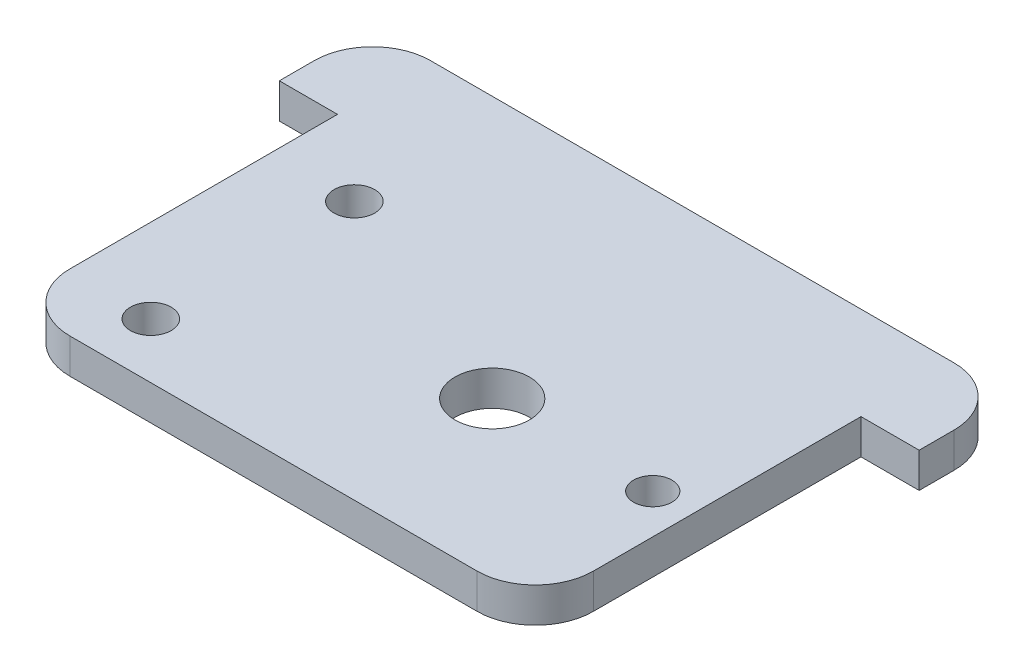
ISO-10303-21;
HEADER;
FILE_DESCRIPTION(('STEP AP214'),'2;1');
FILE_NAME('part.step','',(''),(''),'','','');
FILE_SCHEMA(('AUTOMOTIVE_DESIGN { 1 0 10303 214 1 1 1 1 }'));
ENDSEC;
DATA;
#1=APPLICATION_CONTEXT('core data for automotive mechanical design processes');
#2=APPLICATION_PROTOCOL_DEFINITION('international standard','automotive_design',2000,#1);
#3=PRODUCT_CONTEXT('',#1,'mechanical');
#4=PRODUCT('Part','Part','',(#3));
#5=PRODUCT_RELATED_PRODUCT_CATEGORY('part','',(#4));
#6=PRODUCT_DEFINITION_FORMATION('','',#4);
#7=PRODUCT_DEFINITION_CONTEXT('part definition',#1,'design');
#8=PRODUCT_DEFINITION('design','',#6,#7);
#9=PRODUCT_DEFINITION_SHAPE('','',#8);
#10=(LENGTH_UNIT() NAMED_UNIT(*) SI_UNIT(.MILLI.,.METRE.));
#11=(NAMED_UNIT(*) PLANE_ANGLE_UNIT() SI_UNIT($,.RADIAN.));
#12=(NAMED_UNIT(*) SI_UNIT($,.STERADIAN.) SOLID_ANGLE_UNIT());
#13=UNCERTAINTY_MEASURE_WITH_UNIT(LENGTH_MEASURE(1.E-05),#10,'distance_accuracy_value','');
#14=(GEOMETRIC_REPRESENTATION_CONTEXT(3) GLOBAL_UNCERTAINTY_ASSIGNED_CONTEXT((#13)) GLOBAL_UNIT_ASSIGNED_CONTEXT((#10,
#11,#12)) REPRESENTATION_CONTEXT('',''));
#15=CARTESIAN_POINT('',(0.,0.,0.));
#16=DIRECTION('',(0.,0.,1.));
#17=DIRECTION('',(1.,0.,0.));
#18=AXIS2_PLACEMENT_3D('',#15,#16,#17);
#19=CARTESIAN_POINT('',(0.,3.,-14.));
#20=DIRECTION('',(0.,0.,-1.));
#21=DIRECTION('',(-1.,0.,0.));
#22=AXIS2_PLACEMENT_3D('',#19,#20,#21);
#23=PLANE('',#22);
#24=DIRECTION('',(1.,0.,0.));
#25=VECTOR('',#24,1.);
#26=CARTESIAN_POINT('',(0.,0.,-14.));
#27=LINE('',#26,#25);
#28=CARTESIAN_POINT('',(-27.5,0.,-14.));
#29=VERTEX_POINT('',#28);
#30=CARTESIAN_POINT('',(-22.5,0.,-14.));
#31=VERTEX_POINT('',#30);
#32=EDGE_CURVE('E147',#29,#31,#27,.T.);
#33=ORIENTED_EDGE('',*,*,#32,.T.);
#34=DIRECTION('',(0.,-1.,0.));
#35=VECTOR('',#34,1.);
#36=CARTESIAN_POINT('',(-22.5,3.,-14.));
#37=LINE('',#36,#35);
#38=CARTESIAN_POINT('',(-22.5,3.,-14.));
#39=VERTEX_POINT('',#38);
#40=EDGE_CURVE('E129',#39,#31,#37,.T.);
#41=ORIENTED_EDGE('',*,*,#40,.F.);
#42=DIRECTION('',(1.,0.,0.));
#43=VECTOR('',#42,1.);
#44=CARTESIAN_POINT('',(0.,3.,-14.));
#45=LINE('',#44,#43);
#46=CARTESIAN_POINT('',(-27.5,3.,-14.));
#47=VERTEX_POINT('',#46);
#48=EDGE_CURVE('E135',#47,#39,#45,.T.);
#49=ORIENTED_EDGE('',*,*,#48,.F.);
#50=DIRECTION('',(0.,-1.,0.));
#51=VECTOR('',#50,1.);
#52=CARTESIAN_POINT('',(-27.5,3.,-14.));
#53=LINE('',#52,#51);
#54=EDGE_CURVE('E221',#47,#29,#53,.T.);
#55=ORIENTED_EDGE('',*,*,#54,.T.);
#56=EDGE_LOOP('',(#33,#41,#49,#55));
#57=FACE_BOUND('',#56,.T.);
#58=ADVANCED_FACE('F34',(#57),#23,.F.);
#59=CARTESIAN_POINT('',(-22.5,3.,0.));
#60=DIRECTION('',(-1.,0.,0.));
#61=DIRECTION('',(0.,0.,1.));
#62=AXIS2_PLACEMENT_3D('',#59,#60,#61);
#63=PLANE('',#62);
#64=DIRECTION('',(0.,0.,-1.));
#65=VECTOR('',#64,1.);
#66=CARTESIAN_POINT('',(-22.5,0.,0.));
#67=LINE('',#66,#65);
#68=CARTESIAN_POINT('',(-22.5,0.,9.));
#69=VERTEX_POINT('',#68);
#70=EDGE_CURVE('E242',#69,#31,#67,.T.);
#71=ORIENTED_EDGE('',*,*,#70,.F.);
#72=DIRECTION('',(0.,-1.,0.));
#73=VECTOR('',#72,1.);
#74=CARTESIAN_POINT('',(-22.5,3.,9.));
#75=LINE('',#74,#73);
#76=CARTESIAN_POINT('',(-22.5,3.,9.));
#77=VERTEX_POINT('',#76);
#78=EDGE_CURVE('E132',#69,#77,#75,.F.);
#79=ORIENTED_EDGE('',*,*,#78,.T.);
#80=DIRECTION('',(0.,0.,-1.));
#81=VECTOR('',#80,1.);
#82=CARTESIAN_POINT('',(-22.5,3.,0.));
#83=LINE('',#82,#81);
#84=EDGE_CURVE('E124',#77,#39,#83,.T.);
#85=ORIENTED_EDGE('',*,*,#84,.T.);
#86=ORIENTED_EDGE('',*,*,#40,.T.);
#87=EDGE_LOOP('',(#71,#79,#85,#86));
#88=FACE_BOUND('',#87,.T.);
#89=ADVANCED_FACE('F127',(#88),#63,.T.);
#90=CARTESIAN_POINT('',(0.,3.,14.));
#91=DIRECTION('',(0.,0.,-1.));
#92=DIRECTION('',(-1.,0.,0.));
#93=AXIS2_PLACEMENT_3D('',#90,#91,#92);
#94=PLANE('',#93);
#95=DIRECTION('',(1.,0.,0.));
#96=VECTOR('',#95,1.);
#97=CARTESIAN_POINT('',(0.,0.,14.));
#98=LINE('',#97,#96);
#99=CARTESIAN_POINT('',(-17.5,0.,14.));
#100=VERTEX_POINT('',#99);
#101=CARTESIAN_POINT('',(17.5,0.,14.));
#102=VERTEX_POINT('',#101);
#103=EDGE_CURVE('E239',#100,#102,#98,.T.);
#104=ORIENTED_EDGE('',*,*,#103,.T.);
#105=DIRECTION('',(0.,-1.,0.));
#106=VECTOR('',#105,1.);
#107=CARTESIAN_POINT('',(17.5,3.,14.));
#108=LINE('',#107,#106);
#109=CARTESIAN_POINT('',(17.5,3.,14.));
#110=VERTEX_POINT('',#109);
#111=EDGE_CURVE('E169',#102,#110,#108,.F.);
#112=ORIENTED_EDGE('',*,*,#111,.T.);
#113=DIRECTION('',(1.,0.,0.));
#114=VECTOR('',#113,1.);
#115=CARTESIAN_POINT('',(0.,3.,14.));
#116=LINE('',#115,#114);
#117=CARTESIAN_POINT('',(-17.5,3.,14.));
#118=VERTEX_POINT('',#117);
#119=EDGE_CURVE('E134',#118,#110,#116,.T.);
#120=ORIENTED_EDGE('',*,*,#119,.F.);
#121=DIRECTION('',(0.,-1.,0.));
#122=VECTOR('',#121,1.);
#123=CARTESIAN_POINT('',(-17.5,0.,14.));
#124=LINE('',#123,#122);
#125=EDGE_CURVE('E166',#118,#100,#124,.T.);
#126=ORIENTED_EDGE('',*,*,#125,.T.);
#127=EDGE_LOOP('',(#104,#112,#120,#126));
#128=FACE_BOUND('',#127,.T.);
#129=ADVANCED_FACE('F272',(#128),#94,.F.);
#130=CARTESIAN_POINT('',(22.5,3.,0.));
#131=DIRECTION('',(-1.,0.,0.));
#132=DIRECTION('',(0.,0.,1.));
#133=AXIS2_PLACEMENT_3D('',#130,#131,#132);
#134=PLANE('',#133);
#135=DIRECTION('',(0.,0.,-1.));
#136=VECTOR('',#135,1.);
#137=CARTESIAN_POINT('',(22.5,3.,0.));
#138=LINE('',#137,#136);
#139=CARTESIAN_POINT('',(22.5,3.,9.));
#140=VERTEX_POINT('',#139);
#141=CARTESIAN_POINT('',(22.5,3.,-14.));
#142=VERTEX_POINT('',#141);
#143=EDGE_CURVE('E257',#140,#142,#138,.T.);
#144=ORIENTED_EDGE('',*,*,#143,.F.);
#145=DIRECTION('',(0.,-1.,0.));
#146=VECTOR('',#145,1.);
#147=CARTESIAN_POINT('',(22.5,3.,9.));
#148=LINE('',#147,#146);
#149=CARTESIAN_POINT('',(22.5,0.,9.));
#150=VERTEX_POINT('',#149);
#151=EDGE_CURVE('E148',#140,#150,#148,.T.);
#152=ORIENTED_EDGE('',*,*,#151,.T.);
#153=DIRECTION('',(0.,0.,-1.));
#154=VECTOR('',#153,1.);
#155=CARTESIAN_POINT('',(22.5,0.,0.));
#156=LINE('',#155,#154);
#157=CARTESIAN_POINT('',(22.5,0.,-14.));
#158=VERTEX_POINT('',#157);
#159=EDGE_CURVE('E235',#150,#158,#156,.T.);
#160=ORIENTED_EDGE('',*,*,#159,.T.);
#161=DIRECTION('',(0.,-1.,0.));
#162=VECTOR('',#161,1.);
#163=CARTESIAN_POINT('',(22.5,3.,-14.));
#164=LINE('',#163,#162);
#165=EDGE_CURVE('E149',#142,#158,#164,.T.);
#166=ORIENTED_EDGE('',*,*,#165,.F.);
#167=EDGE_LOOP('',(#144,#152,#160,#166));
#168=FACE_BOUND('',#167,.T.);
#169=ADVANCED_FACE('F269',(#168),#134,.F.);
#170=CARTESIAN_POINT('',(27.5,0.,-14.));
#171=VERTEX_POINT('',#170);
#172=EDGE_CURVE('E234',#158,#171,#27,.T.);
#173=ORIENTED_EDGE('',*,*,#172,.T.);
#174=DIRECTION('',(0.,-1.,0.));
#175=VECTOR('',#174,1.);
#176=CARTESIAN_POINT('',(27.5,3.,-14.));
#177=LINE('',#176,#175);
#178=CARTESIAN_POINT('',(27.5,3.,-14.));
#179=VERTEX_POINT('',#178);
#180=EDGE_CURVE('E155',#179,#171,#177,.T.);
#181=ORIENTED_EDGE('',*,*,#180,.F.);
#182=EDGE_CURVE('E145',#142,#179,#45,.T.);
#183=ORIENTED_EDGE('',*,*,#182,.F.);
#184=ORIENTED_EDGE('',*,*,#165,.T.);
#185=EDGE_LOOP('',(#173,#181,#183,#184));
#186=FACE_BOUND('',#185,.T.);
#187=ADVANCED_FACE('F284',(#186),#23,.F.);
#188=CARTESIAN_POINT('',(27.5,3.,0.));
#189=DIRECTION('',(-1.,0.,0.));
#190=DIRECTION('',(0.,0.,1.));
#191=AXIS2_PLACEMENT_3D('',#188,#189,#190);
#192=PLANE('',#191);
#193=DIRECTION('',(0.,0.,-1.));
#194=VECTOR('',#193,1.);
#195=CARTESIAN_POINT('',(27.5,0.,0.));
#196=LINE('',#195,#194);
#197=CARTESIAN_POINT('',(27.5,0.,-17.));
#198=VERTEX_POINT('',#197);
#199=EDGE_CURVE('E210',#171,#198,#196,.T.);
#200=ORIENTED_EDGE('',*,*,#199,.T.);
#201=DIRECTION('',(0.,-1.,0.));
#202=VECTOR('',#201,1.);
#203=CARTESIAN_POINT('',(27.5,3.,-17.));
#204=LINE('',#203,#202);
#205=CARTESIAN_POINT('',(27.5,3.,-17.));
#206=VERTEX_POINT('',#205);
#207=EDGE_CURVE('E11',#198,#206,#204,.F.);
#208=ORIENTED_EDGE('',*,*,#207,.T.);
#209=DIRECTION('',(0.,0.,-1.));
#210=VECTOR('',#209,1.);
#211=CARTESIAN_POINT('',(27.5,3.,0.));
#212=LINE('',#211,#210);
#213=EDGE_CURVE('E192',#179,#206,#212,.T.);
#214=ORIENTED_EDGE('',*,*,#213,.F.);
#215=ORIENTED_EDGE('',*,*,#180,.T.);
#216=EDGE_LOOP('',(#200,#208,#214,#215));
#217=FACE_BOUND('',#216,.T.);
#218=ADVANCED_FACE('F229',(#217),#192,.F.);
#219=CARTESIAN_POINT('',(0.,3.,-22.));
#220=DIRECTION('',(0.,0.,-1.));
#221=DIRECTION('',(-1.,0.,0.));
#222=AXIS2_PLACEMENT_3D('',#219,#220,#221);
#223=PLANE('',#222);
#224=DIRECTION('',(1.,0.,0.));
#225=VECTOR('',#224,1.);
#226=CARTESIAN_POINT('',(0.,0.,-22.));
#227=LINE('',#226,#225);
#228=CARTESIAN_POINT('',(-22.5,0.,-22.));
#229=VERTEX_POINT('',#228);
#230=CARTESIAN_POINT('',(22.5,0.,-22.));
#231=VERTEX_POINT('',#230);
#232=EDGE_CURVE('E190',#229,#231,#227,.T.);
#233=ORIENTED_EDGE('',*,*,#232,.F.);
#234=DIRECTION('',(0.,-1.,0.));
#235=VECTOR('',#234,1.);
#236=CARTESIAN_POINT('',(-22.5,3.,-22.));
#237=LINE('',#236,#235);
#238=CARTESIAN_POINT('',(-22.5,3.,-22.));
#239=VERTEX_POINT('',#238);
#240=EDGE_CURVE('E42',#229,#239,#237,.F.);
#241=ORIENTED_EDGE('',*,*,#240,.T.);
#242=DIRECTION('',(1.,0.,0.));
#243=VECTOR('',#242,1.);
#244=CARTESIAN_POINT('',(0.,3.,-22.));
#245=LINE('',#244,#243);
#246=CARTESIAN_POINT('',(22.5,3.,-22.));
#247=VERTEX_POINT('',#246);
#248=EDGE_CURVE('E187',#239,#247,#245,.T.);
#249=ORIENTED_EDGE('',*,*,#248,.T.);
#250=DIRECTION('',(0.,-1.,0.));
#251=VECTOR('',#250,1.);
#252=CARTESIAN_POINT('',(22.5,0.,-22.));
#253=LINE('',#252,#251);
#254=EDGE_CURVE('E181',#247,#231,#253,.T.);
#255=ORIENTED_EDGE('',*,*,#254,.T.);
#256=EDGE_LOOP('',(#233,#241,#249,#255));
#257=FACE_BOUND('',#256,.T.);
#258=ADVANCED_FACE('F186',(#257),#223,.T.);
#259=CARTESIAN_POINT('',(-15.3,3.,-8.25));
#260=DIRECTION('',(0.,-1.,0.));
#261=DIRECTION('',(0.,0.,-1.));
#262=AXIS2_PLACEMENT_3D('',#259,#260,#261);
#263=CYLINDRICAL_SURFACE('',#262,1.75);
#264=CARTESIAN_POINT('',(-15.3,3.,-8.25));
#265=DIRECTION('',(0.,1.,0.));
#266=DIRECTION('',(0.,0.,1.));
#267=AXIS2_PLACEMENT_3D('',#264,#265,#266);
#268=CIRCLE('',#267,1.75);
#269=CARTESIAN_POINT('',(-15.3,3.,-6.5));
#270=VERTEX_POINT('',#269);
#271=EDGE_CURVE('E246',#270,#270,#268,.T.);
#272=ORIENTED_EDGE('',*,*,#271,.T.);
#273=EDGE_LOOP('',(#272));
#274=FACE_BOUND('',#273,.T.);
#275=CARTESIAN_POINT('',(-15.3,0.,-8.25));
#276=DIRECTION('',(0.,1.,0.));
#277=DIRECTION('',(0.,0.,1.));
#278=AXIS2_PLACEMENT_3D('',#275,#276,#277);
#279=CIRCLE('',#278,1.75);
#280=CARTESIAN_POINT('',(-15.3,0.,-6.5));
#281=VERTEX_POINT('',#280);
#282=EDGE_CURVE('E216',#281,#281,#279,.T.);
#283=ORIENTED_EDGE('',*,*,#282,.F.);
#284=EDGE_LOOP('',(#283));
#285=FACE_BOUND('',#284,.T.);
#286=ADVANCED_FACE('F355',(#274,#285),#263,.F.);
#287=CARTESIAN_POINT('',(5.3,3.,0.499999999999995));
#288=DIRECTION('',(0.,-1.,0.));
#289=DIRECTION('',(0.,0.,-1.));
#290=AXIS2_PLACEMENT_3D('',#287,#288,#289);
#291=CYLINDRICAL_SURFACE('',#290,3.2);
#292=CARTESIAN_POINT('',(5.3,3.,0.499999999999995));
#293=DIRECTION('',(0.,1.,0.));
#294=DIRECTION('',(0.,0.,1.));
#295=AXIS2_PLACEMENT_3D('',#292,#293,#294);
#296=CIRCLE('',#295,3.2);
#297=CARTESIAN_POINT('',(5.3,3.,3.7));
#298=VERTEX_POINT('',#297);
#299=EDGE_CURVE('E249',#298,#298,#296,.T.);
#300=ORIENTED_EDGE('',*,*,#299,.T.);
#301=EDGE_LOOP('',(#300));
#302=FACE_BOUND('',#301,.T.);
#303=CARTESIAN_POINT('',(5.3,0.,0.499999999999995));
#304=DIRECTION('',(0.,1.,0.));
#305=DIRECTION('',(0.,0.,1.));
#306=AXIS2_PLACEMENT_3D('',#303,#304,#305);
#307=CIRCLE('',#306,3.2);
#308=CARTESIAN_POINT('',(5.3,0.,3.7));
#309=VERTEX_POINT('',#308);
#310=EDGE_CURVE('E208',#309,#309,#307,.T.);
#311=ORIENTED_EDGE('',*,*,#310,.F.);
#312=EDGE_LOOP('',(#311));
#313=FACE_BOUND('',#312,.T.);
#314=ADVANCED_FACE('F400',(#302,#313),#291,.F.);
#315=CARTESIAN_POINT('',(19.1,3.,0.499999999999994));
#316=DIRECTION('',(0.,-1.,0.));
#317=DIRECTION('',(0.,0.,-1.));
#318=AXIS2_PLACEMENT_3D('',#315,#316,#317);
#319=CYLINDRICAL_SURFACE('',#318,1.65);
#320=CARTESIAN_POINT('',(19.1,3.,0.499999999999994));
#321=DIRECTION('',(0.,1.,0.));
#322=DIRECTION('',(0.,0.,1.));
#323=AXIS2_PLACEMENT_3D('',#320,#321,#322);
#324=CIRCLE('',#323,1.65);
#325=CARTESIAN_POINT('',(19.1,3.,2.14999999999999));
#326=VERTEX_POINT('',#325);
#327=EDGE_CURVE('E252',#326,#326,#324,.T.);
#328=ORIENTED_EDGE('',*,*,#327,.T.);
#329=EDGE_LOOP('',(#328));
#330=FACE_BOUND('',#329,.T.);
#331=CARTESIAN_POINT('',(19.1,0.,0.499999999999994));
#332=DIRECTION('',(0.,1.,0.));
#333=DIRECTION('',(0.,0.,1.));
#334=AXIS2_PLACEMENT_3D('',#331,#332,#333);
#335=CIRCLE('',#334,1.65);
#336=CARTESIAN_POINT('',(19.1,0.,2.14999999999999));
#337=VERTEX_POINT('',#336);
#338=EDGE_CURVE('E205',#337,#337,#335,.T.);
#339=ORIENTED_EDGE('',*,*,#338,.F.);
#340=EDGE_LOOP('',(#339));
#341=FACE_BOUND('',#340,.T.);
#342=ADVANCED_FACE('F343',(#330,#341),#319,.F.);
#343=CARTESIAN_POINT('',(-27.5,3.,0.));
#344=DIRECTION('',(-1.,0.,0.));
#345=DIRECTION('',(0.,0.,1.));
#346=AXIS2_PLACEMENT_3D('',#343,#344,#345);
#347=PLANE('',#346);
#348=DIRECTION('',(0.,0.,-1.));
#349=VECTOR('',#348,1.);
#350=CARTESIAN_POINT('',(-27.5,3.,0.));
#351=LINE('',#350,#349);
#352=CARTESIAN_POINT('',(-27.5,3.,-17.));
#353=VERTEX_POINT('',#352);
#354=EDGE_CURVE('E141',#47,#353,#351,.T.);
#355=ORIENTED_EDGE('',*,*,#354,.T.);
#356=DIRECTION('',(0.,-1.,0.));
#357=VECTOR('',#356,1.);
#358=CARTESIAN_POINT('',(-27.5,3.,-17.));
#359=LINE('',#358,#357);
#360=CARTESIAN_POINT('',(-27.5,0.,-17.));
#361=VERTEX_POINT('',#360);
#362=EDGE_CURVE('E178',#353,#361,#359,.T.);
#363=ORIENTED_EDGE('',*,*,#362,.T.);
#364=DIRECTION('',(0.,0.,-1.));
#365=VECTOR('',#364,1.);
#366=CARTESIAN_POINT('',(-27.5,0.,0.));
#367=LINE('',#366,#365);
#368=EDGE_CURVE('E200',#29,#361,#367,.T.);
#369=ORIENTED_EDGE('',*,*,#368,.F.);
#370=ORIENTED_EDGE('',*,*,#54,.F.);
#371=EDGE_LOOP('',(#355,#363,#369,#370));
#372=FACE_BOUND('',#371,.T.);
#373=ADVANCED_FACE('F199',(#372),#347,.T.);
#374=CARTESIAN_POINT('',(-15.3,3.,9.25));
#375=DIRECTION('',(0.,-1.,0.));
#376=DIRECTION('',(0.,0.,-1.));
#377=AXIS2_PLACEMENT_3D('',#374,#375,#376);
#378=CYLINDRICAL_SURFACE('',#377,1.75);
#379=CARTESIAN_POINT('',(-15.3,3.,9.25));
#380=DIRECTION('',(0.,1.,0.));
#381=DIRECTION('',(0.,0.,1.));
#382=AXIS2_PLACEMENT_3D('',#379,#380,#381);
#383=CIRCLE('',#382,1.75);
#384=CARTESIAN_POINT('',(-15.3,3.,11.));
#385=VERTEX_POINT('',#384);
#386=EDGE_CURVE('E222',#385,#385,#383,.T.);
#387=ORIENTED_EDGE('',*,*,#386,.T.);
#388=EDGE_LOOP('',(#387));
#389=FACE_BOUND('',#388,.T.);
#390=CARTESIAN_POINT('',(-15.3,0.,9.25));
#391=DIRECTION('',(0.,1.,0.));
#392=DIRECTION('',(0.,0.,1.));
#393=AXIS2_PLACEMENT_3D('',#390,#391,#392);
#394=CIRCLE('',#393,1.75);
#395=CARTESIAN_POINT('',(-15.3,0.,11.));
#396=VERTEX_POINT('',#395);
#397=EDGE_CURVE('E143',#396,#396,#394,.T.);
#398=ORIENTED_EDGE('',*,*,#397,.F.);
#399=EDGE_LOOP('',(#398));
#400=FACE_BOUND('',#399,.T.);
#401=ADVANCED_FACE('F332',(#389,#400),#378,.F.);
#402=CARTESIAN_POINT('',(0.,3.,0.));
#403=DIRECTION('',(0.,1.,0.));
#404=DIRECTION('',(0.,0.,1.));
#405=AXIS2_PLACEMENT_3D('',#402,#403,#404);
#406=PLANE('',#405);
#407=ORIENTED_EDGE('',*,*,#119,.T.);
#408=CARTESIAN_POINT('',(17.5,3.,9.));
#409=DIRECTION('',(0.,1.,0.));
#410=DIRECTION('',(0.,0.,1.));
#411=AXIS2_PLACEMENT_3D('',#408,#409,#410);
#412=CIRCLE('',#411,5.);
#413=EDGE_CURVE('E175',#110,#140,#412,.T.);
#414=ORIENTED_EDGE('',*,*,#413,.T.);
#415=ORIENTED_EDGE('',*,*,#143,.T.);
#416=ORIENTED_EDGE('',*,*,#182,.T.);
#417=ORIENTED_EDGE('',*,*,#213,.T.);
#418=CARTESIAN_POINT('',(22.5,3.,-17.));
#419=DIRECTION('',(0.,1.,0.));
#420=DIRECTION('',(0.,0.,1.));
#421=AXIS2_PLACEMENT_3D('',#418,#419,#420);
#422=CIRCLE('',#421,5.);
#423=EDGE_CURVE('E55',#206,#247,#422,.T.);
#424=ORIENTED_EDGE('',*,*,#423,.T.);
#425=ORIENTED_EDGE('',*,*,#248,.F.);
#426=CARTESIAN_POINT('',(-22.5,3.,-17.));
#427=DIRECTION('',(0.,1.,0.));
#428=DIRECTION('',(0.,0.,1.));
#429=AXIS2_PLACEMENT_3D('',#426,#427,#428);
#430=CIRCLE('',#429,5.);
#431=EDGE_CURVE('E49',#239,#353,#430,.T.);
#432=ORIENTED_EDGE('',*,*,#431,.T.);
#433=ORIENTED_EDGE('',*,*,#354,.F.);
#434=ORIENTED_EDGE('',*,*,#48,.T.);
#435=ORIENTED_EDGE('',*,*,#84,.F.);
#436=CARTESIAN_POINT('',(-17.5,3.,9.));
#437=DIRECTION('',(0.,1.,0.));
#438=DIRECTION('',(0.,0.,1.));
#439=AXIS2_PLACEMENT_3D('',#436,#437,#438);
#440=CIRCLE('',#439,5.);
#441=EDGE_CURVE('E173',#77,#118,#440,.T.);
#442=ORIENTED_EDGE('',*,*,#441,.T.);
#443=EDGE_LOOP('',(#407,#414,#415,#416,#417,#424,#425,#432,#433,#434,#435,#442));
#444=FACE_BOUND('',#443,.T.);
#445=ORIENTED_EDGE('',*,*,#327,.F.);
#446=EDGE_LOOP('',(#445));
#447=FACE_BOUND('',#446,.T.);
#448=ORIENTED_EDGE('',*,*,#299,.F.);
#449=EDGE_LOOP('',(#448));
#450=FACE_BOUND('',#449,.T.);
#451=ORIENTED_EDGE('',*,*,#271,.F.);
#452=EDGE_LOOP('',(#451));
#453=FACE_BOUND('',#452,.T.);
#454=ORIENTED_EDGE('',*,*,#386,.F.);
#455=EDGE_LOOP('',(#454));
#456=FACE_BOUND('',#455,.T.);
#457=ADVANCED_FACE('F139',(#444,#447,#450,#453,#456),#406,.T.);
#458=CARTESIAN_POINT('',(0.,0.,0.));
#459=DIRECTION('',(0.,1.,0.));
#460=DIRECTION('',(0.,0.,1.));
#461=AXIS2_PLACEMENT_3D('',#458,#459,#460);
#462=PLANE('',#461);
#463=ORIENTED_EDGE('',*,*,#159,.F.);
#464=CARTESIAN_POINT('',(17.5,0.,9.));
#465=DIRECTION('',(0.,1.,0.));
#466=DIRECTION('',(0.,0.,1.));
#467=AXIS2_PLACEMENT_3D('',#464,#465,#466);
#468=CIRCLE('',#467,5.);
#469=EDGE_CURVE('E164',#150,#102,#468,.F.);
#470=ORIENTED_EDGE('',*,*,#469,.T.);
#471=ORIENTED_EDGE('',*,*,#103,.F.);
#472=CARTESIAN_POINT('',(-17.5,0.,9.));
#473=DIRECTION('',(0.,1.,0.));
#474=DIRECTION('',(0.,0.,1.));
#475=AXIS2_PLACEMENT_3D('',#472,#473,#474);
#476=CIRCLE('',#475,5.);
#477=EDGE_CURVE('E162',#100,#69,#476,.F.);
#478=ORIENTED_EDGE('',*,*,#477,.T.);
#479=ORIENTED_EDGE('',*,*,#70,.T.);
#480=ORIENTED_EDGE('',*,*,#32,.F.);
#481=ORIENTED_EDGE('',*,*,#368,.T.);
#482=CARTESIAN_POINT('',(-22.5,0.,-17.));
#483=DIRECTION('',(0.,1.,0.));
#484=DIRECTION('',(0.,0.,1.));
#485=AXIS2_PLACEMENT_3D('',#482,#483,#484);
#486=CIRCLE('',#485,5.);
#487=EDGE_CURVE('E160',#361,#229,#486,.F.);
#488=ORIENTED_EDGE('',*,*,#487,.T.);
#489=ORIENTED_EDGE('',*,*,#232,.T.);
#490=CARTESIAN_POINT('',(22.5,0.,-17.));
#491=DIRECTION('',(0.,1.,0.));
#492=DIRECTION('',(0.,0.,1.));
#493=AXIS2_PLACEMENT_3D('',#490,#491,#492);
#494=CIRCLE('',#493,5.);
#495=EDGE_CURVE('E152',#231,#198,#494,.F.);
#496=ORIENTED_EDGE('',*,*,#495,.T.);
#497=ORIENTED_EDGE('',*,*,#199,.F.);
#498=ORIENTED_EDGE('',*,*,#172,.F.);
#499=EDGE_LOOP('',(#463,#470,#471,#478,#479,#480,#481,#488,#489,#496,#497,#498));
#500=FACE_BOUND('',#499,.T.);
#501=ORIENTED_EDGE('',*,*,#338,.T.);
#502=EDGE_LOOP('',(#501));
#503=FACE_BOUND('',#502,.T.);
#504=ORIENTED_EDGE('',*,*,#310,.T.);
#505=EDGE_LOOP('',(#504));
#506=FACE_BOUND('',#505,.T.);
#507=ORIENTED_EDGE('',*,*,#282,.T.);
#508=EDGE_LOOP('',(#507));
#509=FACE_BOUND('',#508,.T.);
#510=ORIENTED_EDGE('',*,*,#397,.T.);
#511=EDGE_LOOP('',(#510));
#512=FACE_BOUND('',#511,.T.);
#513=ADVANCED_FACE('F203',(#500,#503,#506,#509,#512),#462,.F.);
#514=CARTESIAN_POINT('',(17.5,3.,9.));
#515=DIRECTION('',(0.,-1.,0.));
#516=DIRECTION('',(0.,0.,-1.));
#517=AXIS2_PLACEMENT_3D('',#514,#515,#516);
#518=CYLINDRICAL_SURFACE('',#517,5.);
#519=ORIENTED_EDGE('',*,*,#413,.F.);
#520=ORIENTED_EDGE('',*,*,#111,.F.);
#521=ORIENTED_EDGE('',*,*,#469,.F.);
#522=ORIENTED_EDGE('',*,*,#151,.F.);
#523=EDGE_LOOP('',(#519,#520,#521,#522));
#524=FACE_BOUND('',#523,.T.);
#525=ADVANCED_FACE('F267',(#524),#518,.T.);
#526=CARTESIAN_POINT('',(-17.5,3.,9.));
#527=DIRECTION('',(0.,1.,0.));
#528=DIRECTION('',(0.,0.,1.));
#529=AXIS2_PLACEMENT_3D('',#526,#527,#528);
#530=CYLINDRICAL_SURFACE('',#529,5.);
#531=ORIENTED_EDGE('',*,*,#441,.F.);
#532=ORIENTED_EDGE('',*,*,#78,.F.);
#533=ORIENTED_EDGE('',*,*,#477,.F.);
#534=ORIENTED_EDGE('',*,*,#125,.F.);
#535=EDGE_LOOP('',(#531,#532,#533,#534));
#536=FACE_BOUND('',#535,.T.);
#537=ADVANCED_FACE('F274',(#536),#530,.T.);
#538=CARTESIAN_POINT('',(-22.5,3.,-17.));
#539=DIRECTION('',(0.,-1.,0.));
#540=DIRECTION('',(0.,0.,-1.));
#541=AXIS2_PLACEMENT_3D('',#538,#539,#540);
#542=CYLINDRICAL_SURFACE('',#541,5.);
#543=ORIENTED_EDGE('',*,*,#431,.F.);
#544=ORIENTED_EDGE('',*,*,#240,.F.);
#545=ORIENTED_EDGE('',*,*,#487,.F.);
#546=ORIENTED_EDGE('',*,*,#362,.F.);
#547=EDGE_LOOP('',(#543,#544,#545,#546));
#548=FACE_BOUND('',#547,.T.);
#549=ADVANCED_FACE('F195',(#548),#542,.T.);
#550=CARTESIAN_POINT('',(22.5,3.,-17.));
#551=DIRECTION('',(0.,1.,0.));
#552=DIRECTION('',(0.,0.,1.));
#553=AXIS2_PLACEMENT_3D('',#550,#551,#552);
#554=CYLINDRICAL_SURFACE('',#553,5.);
#555=ORIENTED_EDGE('',*,*,#423,.F.);
#556=ORIENTED_EDGE('',*,*,#207,.F.);
#557=ORIENTED_EDGE('',*,*,#495,.F.);
#558=ORIENTED_EDGE('',*,*,#254,.F.);
#559=EDGE_LOOP('',(#555,#556,#557,#558));
#560=FACE_BOUND('',#559,.T.);
#561=ADVANCED_FACE('F36',(#560),#554,.T.);
#562=CLOSED_SHELL('',(#58,#89,#129,#169,#187,#218,#258,#286,#314,#342,#373,#401,#457,#513,#525,
#537,#549,#561));
#563=MANIFOLD_SOLID_BREP('B2',#562);
#564=ADVANCED_BREP_SHAPE_REPRESENTATION('',(#18,#563),#14);
#565=SHAPE_DEFINITION_REPRESENTATION(#9,#564);
ENDSEC;
END-ISO-10303-21;
